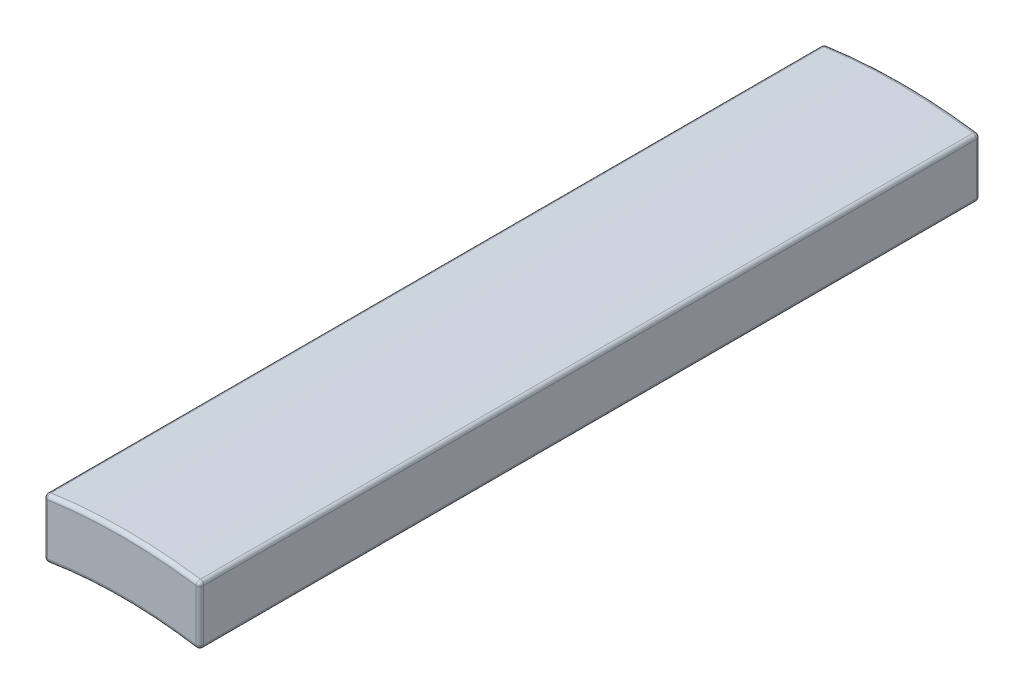
ISO-10303-21;
HEADER;
FILE_DESCRIPTION(('STEP AP214'),'2;1');
FILE_NAME('part.step','',(''),(''),'','','');
FILE_SCHEMA(('AUTOMOTIVE_DESIGN { 1 0 10303 214 1 1 1 1 }'));
ENDSEC;
DATA;
#1=APPLICATION_CONTEXT('core data for automotive mechanical design processes');
#2=APPLICATION_PROTOCOL_DEFINITION('international standard','automotive_design',2000,#1);
#3=PRODUCT_CONTEXT('',#1,'mechanical');
#4=PRODUCT('Part','Part','',(#3));
#5=PRODUCT_RELATED_PRODUCT_CATEGORY('part','',(#4));
#6=PRODUCT_DEFINITION_FORMATION('','',#4);
#7=PRODUCT_DEFINITION_CONTEXT('part definition',#1,'design');
#8=PRODUCT_DEFINITION('design','',#6,#7);
#9=PRODUCT_DEFINITION_SHAPE('','',#8);
#10=(LENGTH_UNIT() NAMED_UNIT(*) SI_UNIT(.MILLI.,.METRE.));
#11=(NAMED_UNIT(*) PLANE_ANGLE_UNIT() SI_UNIT($,.RADIAN.));
#12=(NAMED_UNIT(*) SI_UNIT($,.STERADIAN.) SOLID_ANGLE_UNIT());
#13=UNCERTAINTY_MEASURE_WITH_UNIT(LENGTH_MEASURE(1.E-05),#10,'distance_accuracy_value','');
#14=(GEOMETRIC_REPRESENTATION_CONTEXT(3) GLOBAL_UNCERTAINTY_ASSIGNED_CONTEXT((#13)) GLOBAL_UNIT_ASSIGNED_CONTEXT((#10,
#11,#12)) REPRESENTATION_CONTEXT('',''));
#15=CARTESIAN_POINT('',(0.,0.,0.));
#16=DIRECTION('',(0.,0.,1.));
#17=DIRECTION('',(1.,0.,0.));
#18=AXIS2_PLACEMENT_3D('',#15,#16,#17);
#19=CARTESIAN_POINT('',(0.,0.,0.1));
#20=DIRECTION('',(0.,0.,1.));
#21=DIRECTION('',(1.,0.,0.));
#22=AXIS2_PLACEMENT_3D('',#19,#20,#21);
#23=TOROIDAL_SURFACE('',#22,11.95,0.1);
#24=CARTESIAN_POINT('',(-1.9,11.7979871164534,0.1));
#25=DIRECTION('',(0.987279256606977,0.158995815899586,0.));
#26=DIRECTION('',(-0.158995815899586,0.987279256606977,0.));
#27=AXIS2_PLACEMENT_3D('',#24,#25,#26);
#28=CIRCLE('',#27,0.1);
#29=CARTESIAN_POINT('',(-1.88410041841004,11.6992591907927,0.1));
#30=VERTEX_POINT('',#29);
#31=CARTESIAN_POINT('',(-1.9,11.7979871164534,0.));
#32=VERTEX_POINT('',#31);
#33=EDGE_CURVE('E28',#30,#32,#28,.T.);
#34=ORIENTED_EDGE('',*,*,#33,.T.);
#35=CARTESIAN_POINT('',(0.,0.,0.));
#36=DIRECTION('',(0.,0.,1.));
#37=DIRECTION('',(1.,0.,0.));
#38=AXIS2_PLACEMENT_3D('',#35,#36,#37);
#39=CIRCLE('',#38,11.95);
#40=CARTESIAN_POINT('',(1.9,11.7979871164534,0.));
#41=VERTEX_POINT('',#40);
#42=EDGE_CURVE('E225',#41,#32,#39,.T.);
#43=ORIENTED_EDGE('',*,*,#42,.F.);
#44=CARTESIAN_POINT('',(1.9,11.7979871164534,0.1));
#45=DIRECTION('',(-0.987279256606978,0.158995815899582,0.));
#46=DIRECTION('',(-0.158995815899582,-0.987279256606978,0.));
#47=AXIS2_PLACEMENT_3D('',#44,#45,#46);
#48=CIRCLE('',#47,0.1);
#49=CARTESIAN_POINT('',(1.88410041841004,11.6992591907927,0.1));
#50=VERTEX_POINT('',#49);
#51=EDGE_CURVE('E11',#41,#50,#48,.T.);
#52=ORIENTED_EDGE('',*,*,#51,.T.);
#53=CARTESIAN_POINT('',(0.,0.,0.1));
#54=DIRECTION('',(0.,0.,-1.));
#55=DIRECTION('',(1.,0.,0.));
#56=AXIS2_PLACEMENT_3D('',#53,#54,#55);
#57=CIRCLE('',#56,11.85);
#58=EDGE_CURVE('E286',#30,#50,#57,.T.);
#59=ORIENTED_EDGE('',*,*,#58,.F.);
#60=EDGE_LOOP('',(#34,#43,#52,#59));
#61=FACE_BOUND('',#60,.T.);
#62=ADVANCED_FACE('F17',(#61),#23,.T.);
#63=CARTESIAN_POINT('',(1.9,11.7979871164534,0.1));
#64=DIRECTION('',(0.,1.,0.));
#65=DIRECTION('',(1.,0.,0.));
#66=AXIS2_PLACEMENT_3D('',#63,#64,#65);
#67=SPHERICAL_SURFACE('',#66,0.1);
#68=CARTESIAN_POINT('',(1.9,11.7979871164534,0.1));
#69=DIRECTION('',(0.,-1.,0.));
#70=DIRECTION('',(0.,0.,-1.));
#71=AXIS2_PLACEMENT_3D('',#68,#69,#70);
#72=CIRCLE('',#71,0.1);
#73=CARTESIAN_POINT('',(2.,11.7979871164534,0.1));
#74=VERTEX_POINT('',#73);
#75=EDGE_CURVE('E231',#41,#74,#72,.T.);
#76=ORIENTED_EDGE('',*,*,#75,.T.);
#77=CARTESIAN_POINT('',(1.9,11.7979871164534,0.1));
#78=DIRECTION('',(0.,0.,1.));
#79=DIRECTION('',(-1.,0.,0.));
#80=AXIS2_PLACEMENT_3D('',#77,#78,#79);
#81=CIRCLE('',#80,0.1);
#82=EDGE_CURVE('E232',#50,#74,#81,.T.);
#83=ORIENTED_EDGE('',*,*,#82,.F.);
#84=ORIENTED_EDGE('',*,*,#51,.F.);
#85=EDGE_LOOP('',(#76,#83,#84));
#86=FACE_BOUND('',#85,.T.);
#87=ADVANCED_FACE('F366',(#86),#67,.T.);
#88=CARTESIAN_POINT('',(-1.9,11.7979871164534,0.1));
#89=DIRECTION('',(0.,1.,0.));
#90=DIRECTION('',(1.,0.,0.));
#91=AXIS2_PLACEMENT_3D('',#88,#89,#90);
#92=SPHERICAL_SURFACE('',#91,0.1);
#93=CARTESIAN_POINT('',(-1.9,11.7979871164534,0.1));
#94=DIRECTION('',(0.,0.,1.));
#95=DIRECTION('',(-1.,0.,0.));
#96=AXIS2_PLACEMENT_3D('',#93,#94,#95);
#97=CIRCLE('',#96,0.1);
#98=CARTESIAN_POINT('',(-2.,11.7979871164534,0.1));
#99=VERTEX_POINT('',#98);
#100=EDGE_CURVE('E220',#99,#30,#97,.T.);
#101=ORIENTED_EDGE('',*,*,#100,.F.);
#102=CARTESIAN_POINT('',(-1.9,11.7979871164534,0.1));
#103=DIRECTION('',(0.,-1.,0.));
#104=DIRECTION('',(0.,0.,-1.));
#105=AXIS2_PLACEMENT_3D('',#102,#103,#104);
#106=CIRCLE('',#105,0.1);
#107=EDGE_CURVE('E243',#99,#32,#106,.T.);
#108=ORIENTED_EDGE('',*,*,#107,.T.);
#109=ORIENTED_EDGE('',*,*,#33,.F.);
#110=EDGE_LOOP('',(#101,#108,#109));
#111=FACE_BOUND('',#110,.T.);
#112=ADVANCED_FACE('F19',(#111),#92,.T.);
#113=CARTESIAN_POINT('',(1.9,11.7979871164534,0.1));
#114=DIRECTION('',(0.,1.,0.));
#115=DIRECTION('',(0.,0.,1.));
#116=AXIS2_PLACEMENT_3D('',#113,#114,#115);
#117=CYLINDRICAL_SURFACE('',#116,0.1);
#118=CARTESIAN_POINT('',(1.9,13.1130660030368,0.1));
#119=DIRECTION('',(0.,-1.,0.));
#120=DIRECTION('',(0.,0.,-1.));
#121=AXIS2_PLACEMENT_3D('',#118,#119,#120);
#122=CIRCLE('',#121,0.1);
#123=CARTESIAN_POINT('',(1.9,13.1130660030368,0.));
#124=VERTEX_POINT('',#123);
#125=CARTESIAN_POINT('',(2.,13.1130660030368,0.1));
#126=VERTEX_POINT('',#125);
#127=EDGE_CURVE('E246',#124,#126,#122,.T.);
#128=ORIENTED_EDGE('',*,*,#127,.T.);
#129=DIRECTION('',(0.,1.,0.));
#130=VECTOR('',#129,1.);
#131=CARTESIAN_POINT('',(2.,11.7979871164534,0.1));
#132=LINE('',#131,#130);
#133=EDGE_CURVE('E211',#74,#126,#132,.T.);
#134=ORIENTED_EDGE('',*,*,#133,.F.);
#135=ORIENTED_EDGE('',*,*,#75,.F.);
#136=DIRECTION('',(0.,-1.,0.));
#137=VECTOR('',#136,1.);
#138=CARTESIAN_POINT('',(1.9,11.7979871164534,0.));
#139=LINE('',#138,#137);
#140=EDGE_CURVE('E221',#124,#41,#139,.T.);
#141=ORIENTED_EDGE('',*,*,#140,.F.);
#142=EDGE_LOOP('',(#128,#134,#135,#141));
#143=FACE_BOUND('',#142,.T.);
#144=ADVANCED_FACE('F365',(#143),#117,.T.);
#145=CARTESIAN_POINT('',(-1.9,11.7979871164534,0.1));
#146=DIRECTION('',(0.,-1.,0.));
#147=DIRECTION('',(0.,0.,-1.));
#148=AXIS2_PLACEMENT_3D('',#145,#146,#147);
#149=CYLINDRICAL_SURFACE('',#148,0.1);
#150=CARTESIAN_POINT('',(-1.9,13.1130660030368,0.1));
#151=DIRECTION('',(0.,-1.,0.));
#152=DIRECTION('',(0.,0.,-1.));
#153=AXIS2_PLACEMENT_3D('',#150,#151,#152);
#154=CIRCLE('',#153,0.1);
#155=CARTESIAN_POINT('',(-2.,13.1130660030368,0.1));
#156=VERTEX_POINT('',#155);
#157=CARTESIAN_POINT('',(-1.9,13.1130660030368,0.));
#158=VERTEX_POINT('',#157);
#159=EDGE_CURVE('E43',#156,#158,#154,.T.);
#160=ORIENTED_EDGE('',*,*,#159,.T.);
#161=DIRECTION('',(0.,1.,0.));
#162=VECTOR('',#161,1.);
#163=CARTESIAN_POINT('',(-1.9,11.7979871164534,0.));
#164=LINE('',#163,#162);
#165=EDGE_CURVE('E242',#32,#158,#164,.T.);
#166=ORIENTED_EDGE('',*,*,#165,.F.);
#167=ORIENTED_EDGE('',*,*,#107,.F.);
#168=DIRECTION('',(0.,-1.,0.));
#169=VECTOR('',#168,1.);
#170=CARTESIAN_POINT('',(-2.,11.7979871164534,0.1));
#171=LINE('',#170,#169);
#172=EDGE_CURVE('E21',#156,#99,#171,.T.);
#173=ORIENTED_EDGE('',*,*,#172,.F.);
#174=EDGE_LOOP('',(#160,#166,#167,#173));
#175=FACE_BOUND('',#174,.T.);
#176=ADVANCED_FACE('F363',(#175),#149,.T.);
#177=CARTESIAN_POINT('',(1.9,13.1130660030368,0.1));
#178=DIRECTION('',(0.,1.,0.));
#179=DIRECTION('',(1.,0.,0.));
#180=AXIS2_PLACEMENT_3D('',#177,#178,#179);
#181=SPHERICAL_SURFACE('',#180,0.1);
#182=CARTESIAN_POINT('',(1.9,13.1130660030368,0.1));
#183=DIRECTION('',(0.98966535871976,-0.14339622641509,0.));
#184=DIRECTION('',(0.14339622641509,0.98966535871976,0.));
#185=AXIS2_PLACEMENT_3D('',#182,#183,#184);
#186=CIRCLE('',#185,0.1);
#187=CARTESIAN_POINT('',(1.91433962264151,13.2120325389088,0.1));
#188=VERTEX_POINT('',#187);
#189=EDGE_CURVE('E320',#124,#188,#186,.T.);
#190=ORIENTED_EDGE('',*,*,#189,.T.);
#191=CARTESIAN_POINT('',(1.9,13.1130660030368,0.1));
#192=DIRECTION('',(0.,0.,1.));
#193=DIRECTION('',(-1.,0.,0.));
#194=AXIS2_PLACEMENT_3D('',#191,#192,#193);
#195=CIRCLE('',#194,0.1);
#196=EDGE_CURVE('E180',#126,#188,#195,.T.);
#197=ORIENTED_EDGE('',*,*,#196,.F.);
#198=ORIENTED_EDGE('',*,*,#127,.F.);
#199=EDGE_LOOP('',(#190,#197,#198));
#200=FACE_BOUND('',#199,.T.);
#201=ADVANCED_FACE('F408',(#200),#181,.T.);
#202=CARTESIAN_POINT('',(-1.9,13.1130660030368,0.1));
#203=DIRECTION('',(0.,1.,0.));
#204=DIRECTION('',(1.,0.,0.));
#205=AXIS2_PLACEMENT_3D('',#202,#203,#204);
#206=SPHERICAL_SURFACE('',#205,0.1);
#207=CARTESIAN_POINT('',(-1.9,13.1130660030368,0.1));
#208=DIRECTION('',(0.,0.,1.));
#209=DIRECTION('',(-1.,0.,0.));
#210=AXIS2_PLACEMENT_3D('',#207,#208,#209);
#211=CIRCLE('',#210,0.1);
#212=CARTESIAN_POINT('',(-1.91433962264151,13.2120325389088,0.1));
#213=VERTEX_POINT('',#212);
#214=EDGE_CURVE('E186',#213,#156,#211,.T.);
#215=ORIENTED_EDGE('',*,*,#214,.F.);
#216=CARTESIAN_POINT('',(-1.9,13.1130660030368,0.1));
#217=DIRECTION('',(-0.98966535871976,-0.143396226415095,0.));
#218=DIRECTION('',(0.143396226415095,-0.98966535871976,0.));
#219=AXIS2_PLACEMENT_3D('',#216,#217,#218);
#220=CIRCLE('',#219,0.1);
#221=EDGE_CURVE('E140',#213,#158,#220,.T.);
#222=ORIENTED_EDGE('',*,*,#221,.T.);
#223=ORIENTED_EDGE('',*,*,#159,.F.);
#224=EDGE_LOOP('',(#215,#222,#223));
#225=FACE_BOUND('',#224,.T.);
#226=ADVANCED_FACE('F401',(#225),#206,.T.);
#227=CARTESIAN_POINT('',(0.,0.,0.1));
#228=DIRECTION('',(0.,0.,1.));
#229=DIRECTION('',(1.,0.,0.));
#230=AXIS2_PLACEMENT_3D('',#227,#228,#229);
#231=TOROIDAL_SURFACE('',#230,13.25,0.1);
#232=ORIENTED_EDGE('',*,*,#221,.F.);
#233=CARTESIAN_POINT('',(0.,0.,0.1));
#234=DIRECTION('',(0.,0.,1.));
#235=DIRECTION('',(1.,0.,0.));
#236=AXIS2_PLACEMENT_3D('',#233,#234,#235);
#237=CIRCLE('',#236,13.35);
#238=EDGE_CURVE('E201',#188,#213,#237,.T.);
#239=ORIENTED_EDGE('',*,*,#238,.F.);
#240=ORIENTED_EDGE('',*,*,#189,.F.);
#241=CARTESIAN_POINT('',(0.,0.,0.));
#242=DIRECTION('',(0.,0.,-1.));
#243=DIRECTION('',(1.,0.,0.));
#244=AXIS2_PLACEMENT_3D('',#241,#242,#243);
#245=CIRCLE('',#244,13.25);
#246=EDGE_CURVE('E238',#158,#124,#245,.T.);
#247=ORIENTED_EDGE('',*,*,#246,.F.);
#248=EDGE_LOOP('',(#232,#239,#240,#247));
#249=FACE_BOUND('',#248,.T.);
#250=ADVANCED_FACE('F391',(#249),#231,.T.);
#251=CARTESIAN_POINT('',(-1.9,11.7979871164534,19.9));
#252=DIRECTION('',(0.,1.,0.));
#253=DIRECTION('',(0.,0.,1.));
#254=AXIS2_PLACEMENT_3D('',#251,#252,#253);
#255=CYLINDRICAL_SURFACE('',#254,0.1);
#256=CARTESIAN_POINT('',(-1.9,13.1130660030368,19.9));
#257=DIRECTION('',(0.,-1.,0.));
#258=DIRECTION('',(0.,0.,-1.));
#259=AXIS2_PLACEMENT_3D('',#256,#257,#258);
#260=CIRCLE('',#259,0.1);
#261=CARTESIAN_POINT('',(-1.9,13.1130660030368,20.));
#262=VERTEX_POINT('',#261);
#263=CARTESIAN_POINT('',(-2.,13.1130660030368,19.9));
#264=VERTEX_POINT('',#263);
#265=EDGE_CURVE('E141',#262,#264,#260,.T.);
#266=ORIENTED_EDGE('',*,*,#265,.T.);
#267=DIRECTION('',(0.,1.,0.));
#268=VECTOR('',#267,1.);
#269=CARTESIAN_POINT('',(-2.,13.1130660030368,19.9));
#270=LINE('',#269,#268);
#271=CARTESIAN_POINT('',(-2.,11.7979871164534,19.9));
#272=VERTEX_POINT('',#271);
#273=EDGE_CURVE('E135',#272,#264,#270,.T.);
#274=ORIENTED_EDGE('',*,*,#273,.F.);
#275=CARTESIAN_POINT('',(-1.9,11.7979871164534,19.9));
#276=DIRECTION('',(0.,1.,0.));
#277=DIRECTION('',(0.,0.,1.));
#278=AXIS2_PLACEMENT_3D('',#275,#276,#277);
#279=CIRCLE('',#278,0.1);
#280=CARTESIAN_POINT('',(-1.9,11.7979871164534,20.));
#281=VERTEX_POINT('',#280);
#282=EDGE_CURVE('E128',#272,#281,#279,.T.);
#283=ORIENTED_EDGE('',*,*,#282,.T.);
#284=DIRECTION('',(0.,-1.,0.));
#285=VECTOR('',#284,1.);
#286=CARTESIAN_POINT('',(-1.9,11.7979871164534,20.));
#287=LINE('',#286,#285);
#288=EDGE_CURVE('E132',#262,#281,#287,.T.);
#289=ORIENTED_EDGE('',*,*,#288,.F.);
#290=EDGE_LOOP('',(#266,#274,#283,#289));
#291=FACE_BOUND('',#290,.T.);
#292=ADVANCED_FACE('F130',(#291),#255,.T.);
#293=CARTESIAN_POINT('',(-1.9,11.7979871164534,19.9));
#294=DIRECTION('',(0.,1.,0.));
#295=DIRECTION('',(1.,0.,0.));
#296=AXIS2_PLACEMENT_3D('',#293,#294,#295);
#297=SPHERICAL_SURFACE('',#296,0.1);
#298=CARTESIAN_POINT('',(-1.9,11.7979871164534,19.9));
#299=DIRECTION('',(0.,0.,-1.));
#300=DIRECTION('',(-1.,0.,0.));
#301=AXIS2_PLACEMENT_3D('',#298,#299,#300);
#302=CIRCLE('',#301,0.1);
#303=CARTESIAN_POINT('',(-1.88410041841004,11.6992591907927,19.9));
#304=VERTEX_POINT('',#303);
#305=EDGE_CURVE('E146',#304,#272,#302,.T.);
#306=ORIENTED_EDGE('',*,*,#305,.F.);
#307=CARTESIAN_POINT('',(-1.9,11.7979871164534,19.9));
#308=DIRECTION('',(-0.987279256606977,-0.158995815899584,0.));
#309=DIRECTION('',(0.158995815899584,-0.987279256606977,0.));
#310=AXIS2_PLACEMENT_3D('',#307,#308,#309);
#311=CIRCLE('',#310,0.1);
#312=EDGE_CURVE('E143',#304,#281,#311,.T.);
#313=ORIENTED_EDGE('',*,*,#312,.T.);
#314=ORIENTED_EDGE('',*,*,#282,.F.);
#315=EDGE_LOOP('',(#306,#313,#314));
#316=FACE_BOUND('',#315,.T.);
#317=ADVANCED_FACE('F145',(#316),#297,.T.);
#318=CARTESIAN_POINT('',(-1.9,13.1130660030368,19.9));
#319=DIRECTION('',(0.,1.,0.));
#320=DIRECTION('',(1.,0.,0.));
#321=AXIS2_PLACEMENT_3D('',#318,#319,#320);
#322=SPHERICAL_SURFACE('',#321,0.1);
#323=CARTESIAN_POINT('',(-1.9,13.1130660030368,19.9));
#324=DIRECTION('',(-0.989665358719761,-0.143396226415086,0.));
#325=DIRECTION('',(0.143396226415086,-0.989665358719761,0.));
#326=AXIS2_PLACEMENT_3D('',#323,#324,#325);
#327=CIRCLE('',#326,0.1);
#328=CARTESIAN_POINT('',(-1.91433962264151,13.2120325389088,19.9));
#329=VERTEX_POINT('',#328);
#330=EDGE_CURVE('E152',#262,#329,#327,.T.);
#331=ORIENTED_EDGE('',*,*,#330,.T.);
#332=CARTESIAN_POINT('',(-1.9,13.1130660030368,19.9));
#333=DIRECTION('',(0.,0.,-1.));
#334=DIRECTION('',(-1.,0.,0.));
#335=AXIS2_PLACEMENT_3D('',#332,#333,#334);
#336=CIRCLE('',#335,0.1);
#337=EDGE_CURVE('E209',#264,#329,#336,.T.);
#338=ORIENTED_EDGE('',*,*,#337,.F.);
#339=ORIENTED_EDGE('',*,*,#265,.F.);
#340=EDGE_LOOP('',(#331,#338,#339));
#341=FACE_BOUND('',#340,.T.);
#342=ADVANCED_FACE('F260',(#341),#322,.T.);
#343=CARTESIAN_POINT('',(0.,0.,19.9));
#344=DIRECTION('',(0.,0.,1.));
#345=DIRECTION('',(1.,0.,0.));
#346=AXIS2_PLACEMENT_3D('',#343,#344,#345);
#347=TOROIDAL_SURFACE('',#346,11.95,0.1);
#348=CARTESIAN_POINT('',(1.9,11.7979871164534,19.9));
#349=DIRECTION('',(-0.987279256606978,0.158995815899582,0.));
#350=DIRECTION('',(-0.158995815899582,-0.987279256606978,0.));
#351=AXIS2_PLACEMENT_3D('',#348,#349,#350);
#352=CIRCLE('',#351,0.1);
#353=CARTESIAN_POINT('',(1.88410041841004,11.6992591907927,19.9));
#354=VERTEX_POINT('',#353);
#355=CARTESIAN_POINT('',(1.9,11.7979871164534,20.));
#356=VERTEX_POINT('',#355);
#357=EDGE_CURVE('E157',#354,#356,#352,.T.);
#358=ORIENTED_EDGE('',*,*,#357,.T.);
#359=CARTESIAN_POINT('',(0.,0.,20.));
#360=DIRECTION('',(0.,0.,-1.));
#361=DIRECTION('',(1.,0.,0.));
#362=AXIS2_PLACEMENT_3D('',#359,#360,#361);
#363=CIRCLE('',#362,11.95);
#364=EDGE_CURVE('E155',#281,#356,#363,.T.);
#365=ORIENTED_EDGE('',*,*,#364,.F.);
#366=ORIENTED_EDGE('',*,*,#312,.F.);
#367=CARTESIAN_POINT('',(0.,0.,19.9));
#368=DIRECTION('',(0.,0.,1.));
#369=DIRECTION('',(1.,0.,0.));
#370=AXIS2_PLACEMENT_3D('',#367,#368,#369);
#371=CIRCLE('',#370,11.85);
#372=EDGE_CURVE('E237',#354,#304,#371,.T.);
#373=ORIENTED_EDGE('',*,*,#372,.F.);
#374=EDGE_LOOP('',(#358,#365,#366,#373));
#375=FACE_BOUND('',#374,.T.);
#376=ADVANCED_FACE('F156',(#375),#347,.T.);
#377=CARTESIAN_POINT('',(0.,0.,19.9));
#378=DIRECTION('',(0.,0.,1.));
#379=DIRECTION('',(1.,0.,0.));
#380=AXIS2_PLACEMENT_3D('',#377,#378,#379);
#381=TOROIDAL_SURFACE('',#380,13.25,0.1);
#382=CARTESIAN_POINT('',(1.9,13.1130660030368,19.9));
#383=DIRECTION('',(-0.98966535871976,0.14339622641509,0.));
#384=DIRECTION('',(-0.14339622641509,-0.98966535871976,0.));
#385=AXIS2_PLACEMENT_3D('',#382,#383,#384);
#386=CIRCLE('',#385,0.1);
#387=CARTESIAN_POINT('',(1.9,13.1130660030368,20.));
#388=VERTEX_POINT('',#387);
#389=CARTESIAN_POINT('',(1.91433962264151,13.2120325389088,19.9));
#390=VERTEX_POINT('',#389);
#391=EDGE_CURVE('E191',#388,#390,#386,.T.);
#392=ORIENTED_EDGE('',*,*,#391,.T.);
#393=CARTESIAN_POINT('',(0.,0.,19.9));
#394=DIRECTION('',(0.,0.,-1.));
#395=DIRECTION('',(1.,0.,0.));
#396=AXIS2_PLACEMENT_3D('',#393,#394,#395);
#397=CIRCLE('',#396,13.35);
#398=EDGE_CURVE('E182',#329,#390,#397,.T.);
#399=ORIENTED_EDGE('',*,*,#398,.F.);
#400=ORIENTED_EDGE('',*,*,#330,.F.);
#401=CARTESIAN_POINT('',(0.,0.,20.));
#402=DIRECTION('',(0.,0.,1.));
#403=DIRECTION('',(1.,0.,0.));
#404=AXIS2_PLACEMENT_3D('',#401,#402,#403);
#405=CIRCLE('',#404,13.25);
#406=EDGE_CURVE('E166',#388,#262,#405,.T.);
#407=ORIENTED_EDGE('',*,*,#406,.F.);
#408=EDGE_LOOP('',(#392,#399,#400,#407));
#409=FACE_BOUND('',#408,.T.);
#410=ADVANCED_FACE('F255',(#409),#381,.T.);
#411=CARTESIAN_POINT('',(1.9,11.7979871164534,19.9));
#412=DIRECTION('',(0.,1.,0.));
#413=DIRECTION('',(1.,0.,0.));
#414=AXIS2_PLACEMENT_3D('',#411,#412,#413);
#415=SPHERICAL_SURFACE('',#414,0.1);
#416=CARTESIAN_POINT('',(1.9,11.7979871164534,19.9));
#417=DIRECTION('',(0.,0.,-1.));
#418=DIRECTION('',(-1.,0.,0.));
#419=AXIS2_PLACEMENT_3D('',#416,#417,#418);
#420=CIRCLE('',#419,0.1);
#421=CARTESIAN_POINT('',(2.,11.7979871164534,19.9));
#422=VERTEX_POINT('',#421);
#423=EDGE_CURVE('E215',#422,#354,#420,.T.);
#424=ORIENTED_EDGE('',*,*,#423,.F.);
#425=CARTESIAN_POINT('',(1.9,11.7979871164534,19.9));
#426=DIRECTION('',(0.,-1.,0.));
#427=DIRECTION('',(0.,0.,-1.));
#428=AXIS2_PLACEMENT_3D('',#425,#426,#427);
#429=CIRCLE('',#428,0.1);
#430=EDGE_CURVE('E192',#422,#356,#429,.T.);
#431=ORIENTED_EDGE('',*,*,#430,.T.);
#432=ORIENTED_EDGE('',*,*,#357,.F.);
#433=EDGE_LOOP('',(#424,#431,#432));
#434=FACE_BOUND('',#433,.T.);
#435=ADVANCED_FACE('F416',(#434),#415,.T.);
#436=CARTESIAN_POINT('',(1.9,13.1130660030368,19.9));
#437=DIRECTION('',(0.,1.,0.));
#438=DIRECTION('',(1.,0.,0.));
#439=AXIS2_PLACEMENT_3D('',#436,#437,#438);
#440=SPHERICAL_SURFACE('',#439,0.1);
#441=CARTESIAN_POINT('',(1.9,13.1130660030368,19.9));
#442=DIRECTION('',(0.,1.,0.));
#443=DIRECTION('',(0.,0.,1.));
#444=AXIS2_PLACEMENT_3D('',#441,#442,#443);
#445=CIRCLE('',#444,0.1);
#446=CARTESIAN_POINT('',(2.,13.1130660030368,19.9));
#447=VERTEX_POINT('',#446);
#448=EDGE_CURVE('E188',#388,#447,#445,.T.);
#449=ORIENTED_EDGE('',*,*,#448,.T.);
#450=CARTESIAN_POINT('',(1.9,13.1130660030368,19.9));
#451=DIRECTION('',(0.,0.,-1.));
#452=DIRECTION('',(-1.,0.,0.));
#453=AXIS2_PLACEMENT_3D('',#450,#451,#452);
#454=CIRCLE('',#453,0.1);
#455=EDGE_CURVE('E205',#390,#447,#454,.T.);
#456=ORIENTED_EDGE('',*,*,#455,.F.);
#457=ORIENTED_EDGE('',*,*,#391,.F.);
#458=EDGE_LOOP('',(#449,#456,#457));
#459=FACE_BOUND('',#458,.T.);
#460=ADVANCED_FACE('F412',(#459),#440,.T.);
#461=CARTESIAN_POINT('',(1.9,11.7979871164534,19.9));
#462=DIRECTION('',(0.,-1.,0.));
#463=DIRECTION('',(0.,0.,-1.));
#464=AXIS2_PLACEMENT_3D('',#461,#462,#463);
#465=CYLINDRICAL_SURFACE('',#464,0.1);
#466=ORIENTED_EDGE('',*,*,#430,.F.);
#467=DIRECTION('',(0.,-1.,0.));
#468=VECTOR('',#467,1.);
#469=CARTESIAN_POINT('',(2.,11.7979871164534,19.9));
#470=LINE('',#469,#468);
#471=EDGE_CURVE('E176',#447,#422,#470,.T.);
#472=ORIENTED_EDGE('',*,*,#471,.F.);
#473=ORIENTED_EDGE('',*,*,#448,.F.);
#474=DIRECTION('',(0.,1.,0.));
#475=VECTOR('',#474,1.);
#476=CARTESIAN_POINT('',(1.9,13.1130660030368,20.));
#477=LINE('',#476,#475);
#478=EDGE_CURVE('E162',#356,#388,#477,.T.);
#479=ORIENTED_EDGE('',*,*,#478,.F.);
#480=EDGE_LOOP('',(#466,#472,#473,#479));
#481=FACE_BOUND('',#480,.T.);
#482=ADVANCED_FACE('F415',(#481),#465,.T.);
#483=CARTESIAN_POINT('',(-1.9,11.7979871164534,0.));
#484=DIRECTION('',(0.,0.,1.));
#485=DIRECTION('',(1.,0.,0.));
#486=AXIS2_PLACEMENT_3D('',#483,#484,#485);
#487=PLANE('',#486);
#488=ORIENTED_EDGE('',*,*,#140,.T.);
#489=ORIENTED_EDGE('',*,*,#42,.T.);
#490=ORIENTED_EDGE('',*,*,#165,.T.);
#491=ORIENTED_EDGE('',*,*,#246,.T.);
#492=EDGE_LOOP('',(#488,#489,#490,#491));
#493=FACE_BOUND('',#492,.T.);
#494=ADVANCED_FACE('F398',(#493),#487,.F.);
#495=CARTESIAN_POINT('',(-1.9,11.7979871164534,20.));
#496=DIRECTION('',(0.,0.,1.));
#497=DIRECTION('',(1.,0.,0.));
#498=AXIS2_PLACEMENT_3D('',#495,#496,#497);
#499=PLANE('',#498);
#500=ORIENTED_EDGE('',*,*,#406,.T.);
#501=ORIENTED_EDGE('',*,*,#288,.T.);
#502=ORIENTED_EDGE('',*,*,#364,.T.);
#503=ORIENTED_EDGE('',*,*,#478,.T.);
#504=EDGE_LOOP('',(#500,#501,#502,#503));
#505=FACE_BOUND('',#504,.T.);
#506=ADVANCED_FACE('F164',(#505),#499,.T.);
#507=CARTESIAN_POINT('',(-2.,11.7979871164534,20.));
#508=DIRECTION('',(1.,0.,0.));
#509=DIRECTION('',(0.,1.,0.));
#510=AXIS2_PLACEMENT_3D('',#507,#508,#509);
#511=PLANE('',#510);
#512=DIRECTION('',(0.,0.,-1.));
#513=VECTOR('',#512,1.);
#514=CARTESIAN_POINT('',(-2.,13.1130660030368,20.));
#515=LINE('',#514,#513);
#516=EDGE_CURVE('E206',#264,#156,#515,.T.);
#517=ORIENTED_EDGE('',*,*,#516,.T.);
#518=ORIENTED_EDGE('',*,*,#172,.T.);
#519=DIRECTION('',(0.,0.,-1.));
#520=VECTOR('',#519,1.);
#521=CARTESIAN_POINT('',(-2.,11.7979871164534,20.));
#522=LINE('',#521,#520);
#523=EDGE_CURVE('E216',#272,#99,#522,.T.);
#524=ORIENTED_EDGE('',*,*,#523,.F.);
#525=ORIENTED_EDGE('',*,*,#273,.T.);
#526=EDGE_LOOP('',(#517,#518,#524,#525));
#527=FACE_BOUND('',#526,.T.);
#528=ADVANCED_FACE('F269',(#527),#511,.F.);
#529=CARTESIAN_POINT('',(-1.9,13.1130660030368,20.));
#530=DIRECTION('',(0.,0.,-1.));
#531=DIRECTION('',(-1.,0.,0.));
#532=AXIS2_PLACEMENT_3D('',#529,#530,#531);
#533=CYLINDRICAL_SURFACE('',#532,0.1);
#534=DIRECTION('',(0.,0.,-1.));
#535=VECTOR('',#534,1.);
#536=CARTESIAN_POINT('',(-1.91433962264151,13.2120325389088,20.));
#537=LINE('',#536,#535);
#538=EDGE_CURVE('E187',#329,#213,#537,.T.);
#539=ORIENTED_EDGE('',*,*,#538,.T.);
#540=ORIENTED_EDGE('',*,*,#214,.T.);
#541=ORIENTED_EDGE('',*,*,#516,.F.);
#542=ORIENTED_EDGE('',*,*,#337,.T.);
#543=EDGE_LOOP('',(#539,#540,#541,#542));
#544=FACE_BOUND('',#543,.T.);
#545=ADVANCED_FACE('F264',(#544),#533,.T.);
#546=CARTESIAN_POINT('',(0.,0.,20.));
#547=DIRECTION('',(0.,0.,-1.));
#548=DIRECTION('',(-1.,0.,0.));
#549=AXIS2_PLACEMENT_3D('',#546,#547,#548);
#550=CYLINDRICAL_SURFACE('',#549,13.35);
#551=DIRECTION('',(0.,0.,-1.));
#552=VECTOR('',#551,1.);
#553=CARTESIAN_POINT('',(1.91433962264151,13.2120325389088,20.));
#554=LINE('',#553,#552);
#555=EDGE_CURVE('E196',#390,#188,#554,.T.);
#556=ORIENTED_EDGE('',*,*,#555,.T.);
#557=ORIENTED_EDGE('',*,*,#238,.T.);
#558=ORIENTED_EDGE('',*,*,#538,.F.);
#559=ORIENTED_EDGE('',*,*,#398,.T.);
#560=EDGE_LOOP('',(#556,#557,#558,#559));
#561=FACE_BOUND('',#560,.T.);
#562=ADVANCED_FACE('F431',(#561),#550,.T.);
#563=CARTESIAN_POINT('',(1.9,13.1130660030368,20.));
#564=DIRECTION('',(0.,0.,-1.));
#565=DIRECTION('',(-1.,0.,0.));
#566=AXIS2_PLACEMENT_3D('',#563,#564,#565);
#567=CYLINDRICAL_SURFACE('',#566,0.1);
#568=DIRECTION('',(0.,0.,-1.));
#569=VECTOR('',#568,1.);
#570=CARTESIAN_POINT('',(2.,13.1130660030368,20.));
#571=LINE('',#570,#569);
#572=EDGE_CURVE('E181',#447,#126,#571,.T.);
#573=ORIENTED_EDGE('',*,*,#572,.T.);
#574=ORIENTED_EDGE('',*,*,#196,.T.);
#575=ORIENTED_EDGE('',*,*,#555,.F.);
#576=ORIENTED_EDGE('',*,*,#455,.T.);
#577=EDGE_LOOP('',(#573,#574,#575,#576));
#578=FACE_BOUND('',#577,.T.);
#579=ADVANCED_FACE('F395',(#578),#567,.T.);
#580=CARTESIAN_POINT('',(2.,11.7979871164534,20.));
#581=DIRECTION('',(-1.,0.,0.));
#582=DIRECTION('',(0.,0.,1.));
#583=AXIS2_PLACEMENT_3D('',#580,#581,#582);
#584=PLANE('',#583);
#585=DIRECTION('',(0.,0.,-1.));
#586=VECTOR('',#585,1.);
#587=CARTESIAN_POINT('',(2.,11.7979871164534,20.));
#588=LINE('',#587,#586);
#589=EDGE_CURVE('E236',#422,#74,#588,.T.);
#590=ORIENTED_EDGE('',*,*,#589,.T.);
#591=ORIENTED_EDGE('',*,*,#133,.T.);
#592=ORIENTED_EDGE('',*,*,#572,.F.);
#593=ORIENTED_EDGE('',*,*,#471,.T.);
#594=EDGE_LOOP('',(#590,#591,#592,#593));
#595=FACE_BOUND('',#594,.T.);
#596=ADVANCED_FACE('F418',(#595),#584,.F.);
#597=CARTESIAN_POINT('',(1.9,11.7979871164534,20.));
#598=DIRECTION('',(0.,0.,-1.));
#599=DIRECTION('',(-1.,0.,0.));
#600=AXIS2_PLACEMENT_3D('',#597,#598,#599);
#601=CYLINDRICAL_SURFACE('',#600,0.1);
#602=DIRECTION('',(0.,0.,-1.));
#603=VECTOR('',#602,1.);
#604=CARTESIAN_POINT('',(1.88410041841004,11.6992591907927,20.));
#605=LINE('',#604,#603);
#606=EDGE_CURVE('E290',#354,#50,#605,.T.);
#607=ORIENTED_EDGE('',*,*,#606,.T.);
#608=ORIENTED_EDGE('',*,*,#82,.T.);
#609=ORIENTED_EDGE('',*,*,#589,.F.);
#610=ORIENTED_EDGE('',*,*,#423,.T.);
#611=EDGE_LOOP('',(#607,#608,#609,#610));
#612=FACE_BOUND('',#611,.T.);
#613=ADVANCED_FACE('F404',(#612),#601,.T.);
#614=CARTESIAN_POINT('',(0.,0.,20.));
#615=DIRECTION('',(0.,0.,-1.));
#616=DIRECTION('',(-1.,0.,0.));
#617=AXIS2_PLACEMENT_3D('',#614,#615,#616);
#618=CYLINDRICAL_SURFACE('',#617,11.85);
#619=DIRECTION('',(0.,0.,-1.));
#620=VECTOR('',#619,1.);
#621=CARTESIAN_POINT('',(-1.88410041841004,11.6992591907927,20.));
#622=LINE('',#621,#620);
#623=EDGE_CURVE('E282',#304,#30,#622,.T.);
#624=ORIENTED_EDGE('',*,*,#623,.T.);
#625=ORIENTED_EDGE('',*,*,#58,.T.);
#626=ORIENTED_EDGE('',*,*,#606,.F.);
#627=ORIENTED_EDGE('',*,*,#372,.T.);
#628=EDGE_LOOP('',(#624,#625,#626,#627));
#629=FACE_BOUND('',#628,.T.);
#630=ADVANCED_FACE('F349',(#629),#618,.F.);
#631=CARTESIAN_POINT('',(-1.9,11.7979871164534,20.));
#632=DIRECTION('',(0.,0.,-1.));
#633=DIRECTION('',(-1.,0.,0.));
#634=AXIS2_PLACEMENT_3D('',#631,#632,#633);
#635=CYLINDRICAL_SURFACE('',#634,0.1);
#636=ORIENTED_EDGE('',*,*,#523,.T.);
#637=ORIENTED_EDGE('',*,*,#100,.T.);
#638=ORIENTED_EDGE('',*,*,#623,.F.);
#639=ORIENTED_EDGE('',*,*,#305,.T.);
#640=EDGE_LOOP('',(#636,#637,#638,#639));
#641=FACE_BOUND('',#640,.T.);
#642=ADVANCED_FACE('F347',(#641),#635,.T.);
#643=CLOSED_SHELL('',(#62,#87,#112,#144,#176,#201,#226,#250,#292,#317,#342,#376,#410,#435,#460,
#482,#494,#506,#528,#545,#562,#579,#596,#613,#630,#642));
#644=MANIFOLD_SOLID_BREP('B1',#643);
#645=ADVANCED_BREP_SHAPE_REPRESENTATION('',(#18,#644),#14);
#646=SHAPE_DEFINITION_REPRESENTATION(#9,#645);
ENDSEC;
END-ISO-10303-21;
